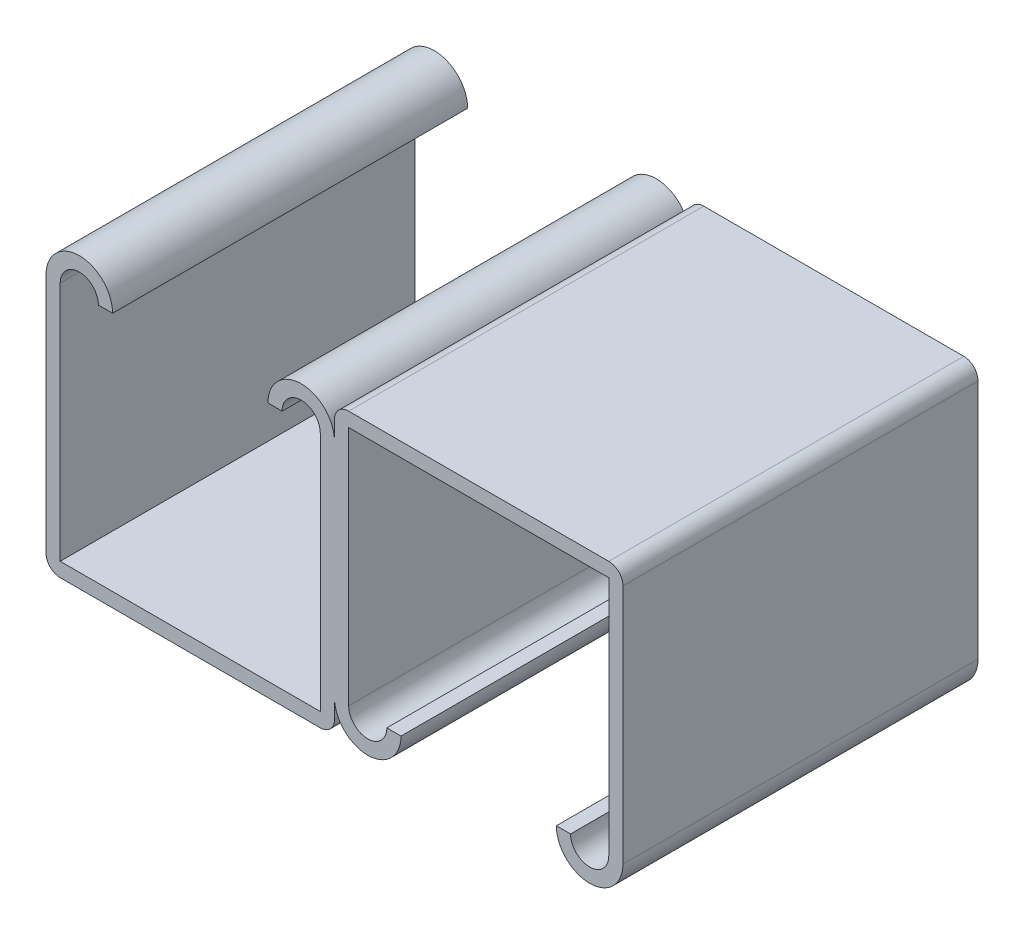
ISO-10303-21;
HEADER;
FILE_DESCRIPTION(('STEP AP214'),'2;1');
FILE_NAME('part.step','',(''),(''),'','','');
FILE_SCHEMA(('AUTOMOTIVE_DESIGN { 1 0 10303 214 1 1 1 1 }'));
ENDSEC;
DATA;
#1=APPLICATION_CONTEXT('core data for automotive mechanical design processes');
#2=APPLICATION_PROTOCOL_DEFINITION('international standard','automotive_design',2000,#1);
#3=PRODUCT_CONTEXT('',#1,'mechanical');
#4=PRODUCT('Part','Part','',(#3));
#5=PRODUCT_RELATED_PRODUCT_CATEGORY('part','',(#4));
#6=PRODUCT_DEFINITION_FORMATION('','',#4);
#7=PRODUCT_DEFINITION_CONTEXT('part definition',#1,'design');
#8=PRODUCT_DEFINITION('design','',#6,#7);
#9=PRODUCT_DEFINITION_SHAPE('','',#8);
#10=(LENGTH_UNIT() NAMED_UNIT(*) SI_UNIT(.MILLI.,.METRE.));
#11=(NAMED_UNIT(*) PLANE_ANGLE_UNIT() SI_UNIT($,.RADIAN.));
#12=(NAMED_UNIT(*) SI_UNIT($,.STERADIAN.) SOLID_ANGLE_UNIT());
#13=UNCERTAINTY_MEASURE_WITH_UNIT(LENGTH_MEASURE(1.E-05),#10,'distance_accuracy_value','');
#14=(GEOMETRIC_REPRESENTATION_CONTEXT(3) GLOBAL_UNCERTAINTY_ASSIGNED_CONTEXT((#13)) GLOBAL_UNIT_ASSIGNED_CONTEXT((#10,
#11,#12)) REPRESENTATION_CONTEXT('',''));
#15=CARTESIAN_POINT('',(0.,0.,0.));
#16=DIRECTION('',(0.,0.,1.));
#17=DIRECTION('',(1.,0.,0.));
#18=AXIS2_PLACEMENT_3D('',#15,#16,#17);
#19=CARTESIAN_POINT('',(-18.25625,7.9375,12.7));
#20=DIRECTION('',(0.,0.,-1.));
#21=DIRECTION('',(-1.,0.,0.));
#22=AXIS2_PLACEMENT_3D('',#19,#20,#21);
#23=CYLINDRICAL_SURFACE('',#22,2.38125);
#24=CARTESIAN_POINT('',(-18.25625,7.9375,-12.7));
#25=DIRECTION('',(0.,0.,1.));
#26=DIRECTION('',(-1.,0.,0.));
#27=AXIS2_PLACEMENT_3D('',#24,#25,#26);
#28=CIRCLE('',#27,2.38125);
#29=CARTESIAN_POINT('',(-15.875,7.9375,-12.7));
#30=VERTEX_POINT('',#29);
#31=CARTESIAN_POINT('',(-20.6375,7.9375,-12.7));
#32=VERTEX_POINT('',#31);
#33=EDGE_CURVE('E242',#30,#32,#28,.T.);
#34=ORIENTED_EDGE('',*,*,#33,.T.);
#35=DIRECTION('',(0.,0.,-1.));
#36=VECTOR('',#35,1.);
#37=CARTESIAN_POINT('',(-20.6375,7.9375,12.7));
#38=LINE('',#37,#36);
#39=CARTESIAN_POINT('',(-20.6375,7.9375,12.7));
#40=VERTEX_POINT('',#39);
#41=EDGE_CURVE('E11',#40,#32,#38,.T.);
#42=ORIENTED_EDGE('',*,*,#41,.F.);
#43=CARTESIAN_POINT('',(-18.25625,7.9375,12.7));
#44=DIRECTION('',(0.,0.,1.));
#45=DIRECTION('',(-1.,0.,0.));
#46=AXIS2_PLACEMENT_3D('',#43,#44,#45);
#47=CIRCLE('',#46,2.38125);
#48=CARTESIAN_POINT('',(-15.875,7.9375,12.7));
#49=VERTEX_POINT('',#48);
#50=EDGE_CURVE('E251',#49,#40,#47,.T.);
#51=ORIENTED_EDGE('',*,*,#50,.F.);
#52=DIRECTION('',(0.,0.,-1.));
#53=VECTOR('',#52,1.);
#54=CARTESIAN_POINT('',(-15.875,7.9375,12.7));
#55=LINE('',#54,#53);
#56=EDGE_CURVE('E279',#49,#30,#55,.T.);
#57=ORIENTED_EDGE('',*,*,#56,.T.);
#58=EDGE_LOOP('',(#34,#42,#51,#57));
#59=FACE_BOUND('',#58,.T.);
#60=ADVANCED_FACE('F32',(#59),#23,.T.);
#61=CARTESIAN_POINT('',(-20.6375,7.9375,12.7));
#62=DIRECTION('',(1.,0.,0.));
#63=DIRECTION('',(0.,1.,0.));
#64=AXIS2_PLACEMENT_3D('',#61,#62,#63);
#65=PLANE('',#64);
#66=DIRECTION('',(0.,-1.,0.));
#67=VECTOR('',#66,1.);
#68=CARTESIAN_POINT('',(-20.6375,7.9375,-12.7));
#69=LINE('',#68,#67);
#70=CARTESIAN_POINT('',(-20.6375,-9.30275,-12.7));
#71=VERTEX_POINT('',#70);
#72=EDGE_CURVE('E245',#32,#71,#69,.T.);
#73=ORIENTED_EDGE('',*,*,#72,.T.);
#74=DIRECTION('',(0.,0.,-1.));
#75=VECTOR('',#74,1.);
#76=CARTESIAN_POINT('',(-20.6375,-9.30275,12.7));
#77=LINE('',#76,#75);
#78=CARTESIAN_POINT('',(-20.6375,-9.30275,12.7));
#79=VERTEX_POINT('',#78);
#80=EDGE_CURVE('E39',#79,#71,#77,.T.);
#81=ORIENTED_EDGE('',*,*,#80,.F.);
#82=DIRECTION('',(0.,-1.,0.));
#83=VECTOR('',#82,1.);
#84=CARTESIAN_POINT('',(-20.6375,7.9375,12.7));
#85=LINE('',#84,#83);
#86=EDGE_CURVE('E253',#40,#79,#85,.T.);
#87=ORIENTED_EDGE('',*,*,#86,.F.);
#88=ORIENTED_EDGE('',*,*,#41,.T.);
#89=EDGE_LOOP('',(#73,#81,#87,#88));
#90=FACE_BOUND('',#89,.T.);
#91=ADVANCED_FACE('F361',(#90),#65,.F.);
#92=CARTESIAN_POINT('',(-19.6215,-9.30275,12.7));
#93=DIRECTION('',(0.,0.,-1.));
#94=DIRECTION('',(-1.,0.,0.));
#95=AXIS2_PLACEMENT_3D('',#92,#93,#94);
#96=CYLINDRICAL_SURFACE('',#95,1.016);
#97=CARTESIAN_POINT('',(-19.6215,-9.30275,-12.7));
#98=DIRECTION('',(0.,0.,1.));
#99=DIRECTION('',(-1.,0.,0.));
#100=AXIS2_PLACEMENT_3D('',#97,#98,#99);
#101=CIRCLE('',#100,1.016);
#102=CARTESIAN_POINT('',(-19.6215,-10.31875,-12.7));
#103=VERTEX_POINT('',#102);
#104=EDGE_CURVE('E282',#71,#103,#101,.T.);
#105=ORIENTED_EDGE('',*,*,#104,.T.);
#106=DIRECTION('',(0.,0.,-1.));
#107=VECTOR('',#106,1.);
#108=CARTESIAN_POINT('',(-19.6215,-10.31875,12.7));
#109=LINE('',#108,#107);
#110=CARTESIAN_POINT('',(-19.6215,-10.31875,12.7));
#111=VERTEX_POINT('',#110);
#112=EDGE_CURVE('E335',#111,#103,#109,.T.);
#113=ORIENTED_EDGE('',*,*,#112,.F.);
#114=CARTESIAN_POINT('',(-19.6215,-9.30275,12.7));
#115=DIRECTION('',(0.,0.,1.));
#116=DIRECTION('',(-1.,0.,0.));
#117=AXIS2_PLACEMENT_3D('',#114,#115,#116);
#118=CIRCLE('',#117,1.016);
#119=EDGE_CURVE('E256',#79,#111,#118,.T.);
#120=ORIENTED_EDGE('',*,*,#119,.F.);
#121=ORIENTED_EDGE('',*,*,#80,.T.);
#122=EDGE_LOOP('',(#105,#113,#120,#121));
#123=FACE_BOUND('',#122,.T.);
#124=ADVANCED_FACE('F342',(#123),#96,.T.);
#125=CARTESIAN_POINT('',(-19.6215,-10.31875,12.7));
#126=DIRECTION('',(0.,1.,0.));
#127=DIRECTION('',(-1.,0.,0.));
#128=AXIS2_PLACEMENT_3D('',#125,#126,#127);
#129=PLANE('',#128);
#130=DIRECTION('',(1.,0.,0.));
#131=VECTOR('',#130,1.);
#132=CARTESIAN_POINT('',(-19.6215,-10.31875,-12.7));
#133=LINE('',#132,#131);
#134=CARTESIAN_POINT('',(-1.016,-10.31875,-12.7));
#135=VERTEX_POINT('',#134);
#136=EDGE_CURVE('E284',#103,#135,#133,.T.);
#137=ORIENTED_EDGE('',*,*,#136,.T.);
#138=DIRECTION('',(0.,0.,-1.));
#139=VECTOR('',#138,1.);
#140=CARTESIAN_POINT('',(-1.016,-10.31875,12.7));
#141=LINE('',#140,#139);
#142=CARTESIAN_POINT('',(-1.016,-10.31875,12.7));
#143=VERTEX_POINT('',#142);
#144=EDGE_CURVE('E332',#143,#135,#141,.T.);
#145=ORIENTED_EDGE('',*,*,#144,.F.);
#146=DIRECTION('',(1.,0.,0.));
#147=VECTOR('',#146,1.);
#148=CARTESIAN_POINT('',(-19.6215,-10.31875,12.7));
#149=LINE('',#148,#147);
#150=EDGE_CURVE('E258',#111,#143,#149,.T.);
#151=ORIENTED_EDGE('',*,*,#150,.F.);
#152=ORIENTED_EDGE('',*,*,#112,.T.);
#153=EDGE_LOOP('',(#137,#145,#151,#152));
#154=FACE_BOUND('',#153,.T.);
#155=ADVANCED_FACE('F352',(#154),#129,.F.);
#156=CARTESIAN_POINT('',(-1.016,-9.30275,12.7));
#157=DIRECTION('',(0.,0.,-1.));
#158=DIRECTION('',(-1.,0.,0.));
#159=AXIS2_PLACEMENT_3D('',#156,#157,#158);
#160=CYLINDRICAL_SURFACE('',#159,1.016);
#161=CARTESIAN_POINT('',(-1.016,-9.30275,-12.7));
#162=DIRECTION('',(0.,0.,1.));
#163=DIRECTION('',(1.,0.,0.));
#164=AXIS2_PLACEMENT_3D('',#161,#162,#163);
#165=CIRCLE('',#164,1.016);
#166=CARTESIAN_POINT('',(0.,-9.30275,-12.7));
#167=VERTEX_POINT('',#166);
#168=EDGE_CURVE('E286',#135,#167,#165,.T.);
#169=ORIENTED_EDGE('',*,*,#168,.T.);
#170=DIRECTION('',(0.,0.,-1.));
#171=VECTOR('',#170,1.);
#172=CARTESIAN_POINT('',(0.,-9.30275,12.7));
#173=LINE('',#172,#171);
#174=CARTESIAN_POINT('',(0.,-9.30275,12.7));
#175=VERTEX_POINT('',#174);
#176=EDGE_CURVE('E330',#175,#167,#173,.T.);
#177=ORIENTED_EDGE('',*,*,#176,.F.);
#178=CARTESIAN_POINT('',(-1.016,-9.30275,12.7));
#179=DIRECTION('',(0.,0.,1.));
#180=DIRECTION('',(1.,0.,0.));
#181=AXIS2_PLACEMENT_3D('',#178,#179,#180);
#182=CIRCLE('',#181,1.016);
#183=EDGE_CURVE('E260',#143,#175,#182,.T.);
#184=ORIENTED_EDGE('',*,*,#183,.F.);
#185=ORIENTED_EDGE('',*,*,#144,.T.);
#186=EDGE_LOOP('',(#169,#177,#184,#185));
#187=FACE_BOUND('',#186,.T.);
#188=ADVANCED_FACE('F356',(#187),#160,.T.);
#189=CARTESIAN_POINT('',(0.,-9.30275,12.7));
#190=DIRECTION('',(-1.,0.,0.));
#191=DIRECTION('',(0.,0.,1.));
#192=AXIS2_PLACEMENT_3D('',#189,#190,#191);
#193=PLANE('',#192);
#194=DIRECTION('',(0.,1.,0.));
#195=VECTOR('',#194,1.);
#196=CARTESIAN_POINT('',(0.,-9.30275,-12.7));
#197=LINE('',#196,#195);
#198=CARTESIAN_POINT('',(0.,-7.93749999999998,-12.7));
#199=VERTEX_POINT('',#198);
#200=EDGE_CURVE('E51',#167,#199,#197,.T.);
#201=ORIENTED_EDGE('',*,*,#200,.T.);
#202=DIRECTION('',(0.,0.,-1.));
#203=VECTOR('',#202,1.);
#204=CARTESIAN_POINT('',(0.,-7.9375,12.7));
#205=LINE('',#204,#203);
#206=CARTESIAN_POINT('',(0.,-7.93749999999998,12.7));
#207=VERTEX_POINT('',#206);
#208=EDGE_CURVE('E46',#207,#199,#205,.T.);
#209=ORIENTED_EDGE('',*,*,#208,.F.);
#210=DIRECTION('',(0.,1.,0.));
#211=VECTOR('',#210,1.);
#212=CARTESIAN_POINT('',(0.,-9.30275,12.7));
#213=LINE('',#212,#211);
#214=EDGE_CURVE('E262',#175,#207,#213,.T.);
#215=ORIENTED_EDGE('',*,*,#214,.F.);
#216=ORIENTED_EDGE('',*,*,#176,.T.);
#217=EDGE_LOOP('',(#201,#209,#215,#216));
#218=FACE_BOUND('',#217,.T.);
#219=ADVANCED_FACE('F520',(#218),#193,.F.);
#220=CARTESIAN_POINT('',(-2.38125,7.9375,12.7));
#221=DIRECTION('',(0.,0.,-1.));
#222=DIRECTION('',(-1.,0.,0.));
#223=AXIS2_PLACEMENT_3D('',#220,#221,#222);
#224=CYLINDRICAL_SURFACE('',#223,2.38125);
#225=CARTESIAN_POINT('',(-2.38125,7.9375,-12.7));
#226=DIRECTION('',(0.,0.,1.));
#227=DIRECTION('',(1.,0.,0.));
#228=AXIS2_PLACEMENT_3D('',#225,#226,#227);
#229=CIRCLE('',#228,2.38125);
#230=CARTESIAN_POINT('',(0.,7.93750000000002,-12.7));
#231=VERTEX_POINT('',#230);
#232=CARTESIAN_POINT('',(-4.7625,7.9375,-12.7));
#233=VERTEX_POINT('',#232);
#234=EDGE_CURVE('E289',#231,#233,#229,.T.);
#235=ORIENTED_EDGE('',*,*,#234,.T.);
#236=DIRECTION('',(0.,0.,-1.));
#237=VECTOR('',#236,1.);
#238=CARTESIAN_POINT('',(-4.7625,7.9375,12.7));
#239=LINE('',#238,#237);
#240=CARTESIAN_POINT('',(-4.7625,7.9375,12.7));
#241=VERTEX_POINT('',#240);
#242=EDGE_CURVE('E324',#241,#233,#239,.T.);
#243=ORIENTED_EDGE('',*,*,#242,.F.);
#244=CARTESIAN_POINT('',(-2.38125,7.9375,12.7));
#245=DIRECTION('',(0.,0.,1.));
#246=DIRECTION('',(1.,0.,0.));
#247=AXIS2_PLACEMENT_3D('',#244,#245,#246);
#248=CIRCLE('',#247,2.38125);
#249=CARTESIAN_POINT('',(0.,7.9375,12.7));
#250=VERTEX_POINT('',#249);
#251=EDGE_CURVE('E264',#250,#241,#248,.T.);
#252=ORIENTED_EDGE('',*,*,#251,.F.);
#253=DIRECTION('',(0.,0.,-1.));
#254=VECTOR('',#253,1.);
#255=CARTESIAN_POINT('',(0.,7.9375,12.7));
#256=LINE('',#255,#254);
#257=EDGE_CURVE('E327',#250,#231,#256,.T.);
#258=ORIENTED_EDGE('',*,*,#257,.T.);
#259=EDGE_LOOP('',(#235,#243,#252,#258));
#260=FACE_BOUND('',#259,.T.);
#261=ADVANCED_FACE('F401',(#260),#224,.T.);
#262=CARTESIAN_POINT('',(-4.7625,7.9375,12.7));
#263=DIRECTION('',(0.,1.,0.));
#264=DIRECTION('',(0.,0.,1.));
#265=AXIS2_PLACEMENT_3D('',#262,#263,#264);
#266=PLANE('',#265);
#267=DIRECTION('',(1.,0.,0.));
#268=VECTOR('',#267,1.);
#269=CARTESIAN_POINT('',(-4.7625,7.9375,-12.7));
#270=LINE('',#269,#268);
#271=CARTESIAN_POINT('',(-3.7465,7.9375,-12.7));
#272=VERTEX_POINT('',#271);
#273=EDGE_CURVE('E291',#233,#272,#270,.T.);
#274=ORIENTED_EDGE('',*,*,#273,.T.);
#275=DIRECTION('',(0.,0.,-1.));
#276=VECTOR('',#275,1.);
#277=CARTESIAN_POINT('',(-3.7465,7.9375,12.7));
#278=LINE('',#277,#276);
#279=CARTESIAN_POINT('',(-3.7465,7.9375,12.7));
#280=VERTEX_POINT('',#279);
#281=EDGE_CURVE('E321',#280,#272,#278,.T.);
#282=ORIENTED_EDGE('',*,*,#281,.F.);
#283=DIRECTION('',(1.,0.,0.));
#284=VECTOR('',#283,1.);
#285=CARTESIAN_POINT('',(-4.7625,7.9375,12.7));
#286=LINE('',#285,#284);
#287=EDGE_CURVE('E266',#241,#280,#286,.T.);
#288=ORIENTED_EDGE('',*,*,#287,.F.);
#289=ORIENTED_EDGE('',*,*,#242,.T.);
#290=EDGE_LOOP('',(#274,#282,#288,#289));
#291=FACE_BOUND('',#290,.T.);
#292=ADVANCED_FACE('F397',(#291),#266,.F.);
#293=CARTESIAN_POINT('',(-2.38125,7.9375,12.7));
#294=DIRECTION('',(0.,0.,-1.));
#295=DIRECTION('',(-1.,0.,0.));
#296=AXIS2_PLACEMENT_3D('',#293,#294,#295);
#297=CYLINDRICAL_SURFACE('',#296,1.36525);
#298=CARTESIAN_POINT('',(-2.38125,7.9375,-12.7));
#299=DIRECTION('',(0.,0.,-1.));
#300=DIRECTION('',(1.,0.,0.));
#301=AXIS2_PLACEMENT_3D('',#298,#299,#300);
#302=CIRCLE('',#301,1.36525);
#303=CARTESIAN_POINT('',(-1.016,7.9375,-12.7));
#304=VERTEX_POINT('',#303);
#305=EDGE_CURVE('E293',#272,#304,#302,.T.);
#306=ORIENTED_EDGE('',*,*,#305,.T.);
#307=DIRECTION('',(0.,0.,-1.));
#308=VECTOR('',#307,1.);
#309=CARTESIAN_POINT('',(-1.016,7.9375,12.7));
#310=LINE('',#309,#308);
#311=CARTESIAN_POINT('',(-1.016,7.9375,12.7));
#312=VERTEX_POINT('',#311);
#313=EDGE_CURVE('E318',#312,#304,#310,.T.);
#314=ORIENTED_EDGE('',*,*,#313,.F.);
#315=CARTESIAN_POINT('',(-2.38125,7.9375,12.7));
#316=DIRECTION('',(0.,0.,-1.));
#317=DIRECTION('',(1.,0.,0.));
#318=AXIS2_PLACEMENT_3D('',#315,#316,#317);
#319=CIRCLE('',#318,1.36525);
#320=EDGE_CURVE('E268',#280,#312,#319,.T.);
#321=ORIENTED_EDGE('',*,*,#320,.F.);
#322=ORIENTED_EDGE('',*,*,#281,.T.);
#323=EDGE_LOOP('',(#306,#314,#321,#322));
#324=FACE_BOUND('',#323,.T.);
#325=ADVANCED_FACE('F392',(#324),#297,.F.);
#326=CARTESIAN_POINT('',(-1.016,-9.30275,12.7));
#327=DIRECTION('',(1.,0.,0.));
#328=DIRECTION('',(0.,0.,-1.));
#329=AXIS2_PLACEMENT_3D('',#326,#327,#328);
#330=PLANE('',#329);
#331=DIRECTION('',(0.,-1.,0.));
#332=VECTOR('',#331,1.);
#333=CARTESIAN_POINT('',(-1.016,-9.30275,-12.7));
#334=LINE('',#333,#332);
#335=CARTESIAN_POINT('',(-1.016,-9.30275,-12.7));
#336=VERTEX_POINT('',#335);
#337=EDGE_CURVE('E295',#304,#336,#334,.T.);
#338=ORIENTED_EDGE('',*,*,#337,.T.);
#339=DIRECTION('',(0.,0.,-1.));
#340=VECTOR('',#339,1.);
#341=CARTESIAN_POINT('',(-1.016,-9.30275,12.7));
#342=LINE('',#341,#340);
#343=CARTESIAN_POINT('',(-1.016,-9.30275,12.7));
#344=VERTEX_POINT('',#343);
#345=EDGE_CURVE('E315',#344,#336,#342,.T.);
#346=ORIENTED_EDGE('',*,*,#345,.F.);
#347=DIRECTION('',(0.,-1.,0.));
#348=VECTOR('',#347,1.);
#349=CARTESIAN_POINT('',(-1.016,-9.30275,12.7));
#350=LINE('',#349,#348);
#351=EDGE_CURVE('E270',#312,#344,#350,.T.);
#352=ORIENTED_EDGE('',*,*,#351,.F.);
#353=ORIENTED_EDGE('',*,*,#313,.T.);
#354=EDGE_LOOP('',(#338,#346,#352,#353));
#355=FACE_BOUND('',#354,.T.);
#356=ADVANCED_FACE('F388',(#355),#330,.F.);
#357=CARTESIAN_POINT('',(-19.6215,-9.30275,12.7));
#358=DIRECTION('',(0.,-1.,0.));
#359=DIRECTION('',(0.,0.,-1.));
#360=AXIS2_PLACEMENT_3D('',#357,#358,#359);
#361=PLANE('',#360);
#362=DIRECTION('',(-1.,0.,0.));
#363=VECTOR('',#362,1.);
#364=CARTESIAN_POINT('',(-19.6215,-9.30275,-12.7));
#365=LINE('',#364,#363);
#366=CARTESIAN_POINT('',(-19.6215,-9.30275,-12.7));
#367=VERTEX_POINT('',#366);
#368=EDGE_CURVE('E297',#336,#367,#365,.T.);
#369=ORIENTED_EDGE('',*,*,#368,.T.);
#370=DIRECTION('',(0.,0.,-1.));
#371=VECTOR('',#370,1.);
#372=CARTESIAN_POINT('',(-19.6215,-9.30275,12.7));
#373=LINE('',#372,#371);
#374=CARTESIAN_POINT('',(-19.6215,-9.30275,12.7));
#375=VERTEX_POINT('',#374);
#376=EDGE_CURVE('E312',#375,#367,#373,.T.);
#377=ORIENTED_EDGE('',*,*,#376,.F.);
#378=DIRECTION('',(-1.,0.,0.));
#379=VECTOR('',#378,1.);
#380=CARTESIAN_POINT('',(-19.6215,-9.30275,12.7));
#381=LINE('',#380,#379);
#382=EDGE_CURVE('E272',#344,#375,#381,.T.);
#383=ORIENTED_EDGE('',*,*,#382,.F.);
#384=ORIENTED_EDGE('',*,*,#345,.T.);
#385=EDGE_LOOP('',(#369,#377,#383,#384));
#386=FACE_BOUND('',#385,.T.);
#387=ADVANCED_FACE('F383',(#386),#361,.F.);
#388=CARTESIAN_POINT('',(-19.6215,7.9375,12.7));
#389=DIRECTION('',(-1.,0.,0.));
#390=DIRECTION('',(0.,0.,1.));
#391=AXIS2_PLACEMENT_3D('',#388,#389,#390);
#392=PLANE('',#391);
#393=DIRECTION('',(0.,1.,0.));
#394=VECTOR('',#393,1.);
#395=CARTESIAN_POINT('',(-19.6215,7.9375,-12.7));
#396=LINE('',#395,#394);
#397=CARTESIAN_POINT('',(-19.6215,7.9375,-12.7));
#398=VERTEX_POINT('',#397);
#399=EDGE_CURVE('E299',#367,#398,#396,.T.);
#400=ORIENTED_EDGE('',*,*,#399,.T.);
#401=DIRECTION('',(0.,0.,-1.));
#402=VECTOR('',#401,1.);
#403=CARTESIAN_POINT('',(-19.6215,7.9375,12.7));
#404=LINE('',#403,#402);
#405=CARTESIAN_POINT('',(-19.6215,7.9375,12.7));
#406=VERTEX_POINT('',#405);
#407=EDGE_CURVE('E309',#406,#398,#404,.T.);
#408=ORIENTED_EDGE('',*,*,#407,.F.);
#409=DIRECTION('',(0.,1.,0.));
#410=VECTOR('',#409,1.);
#411=CARTESIAN_POINT('',(-19.6215,7.9375,12.7));
#412=LINE('',#411,#410);
#413=EDGE_CURVE('E274',#375,#406,#412,.T.);
#414=ORIENTED_EDGE('',*,*,#413,.F.);
#415=ORIENTED_EDGE('',*,*,#376,.T.);
#416=EDGE_LOOP('',(#400,#408,#414,#415));
#417=FACE_BOUND('',#416,.T.);
#418=ADVANCED_FACE('F377',(#417),#392,.F.);
#419=CARTESIAN_POINT('',(-18.25625,7.9375,12.7));
#420=DIRECTION('',(0.,0.,-1.));
#421=DIRECTION('',(-1.,0.,0.));
#422=AXIS2_PLACEMENT_3D('',#419,#420,#421);
#423=CYLINDRICAL_SURFACE('',#422,1.36525);
#424=CARTESIAN_POINT('',(-18.25625,7.9375,-12.7));
#425=DIRECTION('',(0.,0.,-1.));
#426=DIRECTION('',(-1.,0.,0.));
#427=AXIS2_PLACEMENT_3D('',#424,#425,#426);
#428=CIRCLE('',#427,1.36525);
#429=CARTESIAN_POINT('',(-16.891,7.9375,-12.7));
#430=VERTEX_POINT('',#429);
#431=EDGE_CURVE('E301',#398,#430,#428,.T.);
#432=ORIENTED_EDGE('',*,*,#431,.T.);
#433=DIRECTION('',(0.,0.,-1.));
#434=VECTOR('',#433,1.);
#435=CARTESIAN_POINT('',(-16.891,7.9375,12.7));
#436=LINE('',#435,#434);
#437=CARTESIAN_POINT('',(-16.891,7.9375,12.7));
#438=VERTEX_POINT('',#437);
#439=EDGE_CURVE('E306',#438,#430,#436,.T.);
#440=ORIENTED_EDGE('',*,*,#439,.F.);
#441=CARTESIAN_POINT('',(-18.25625,7.9375,12.7));
#442=DIRECTION('',(0.,0.,-1.));
#443=DIRECTION('',(-1.,0.,0.));
#444=AXIS2_PLACEMENT_3D('',#441,#442,#443);
#445=CIRCLE('',#444,1.36525);
#446=EDGE_CURVE('E276',#406,#438,#445,.T.);
#447=ORIENTED_EDGE('',*,*,#446,.F.);
#448=ORIENTED_EDGE('',*,*,#407,.T.);
#449=EDGE_LOOP('',(#432,#440,#447,#448));
#450=FACE_BOUND('',#449,.T.);
#451=ADVANCED_FACE('F373',(#450),#423,.F.);
#452=CARTESIAN_POINT('',(-16.891,7.9375,12.7));
#453=DIRECTION('',(0.,1.,0.));
#454=DIRECTION('',(0.,0.,1.));
#455=AXIS2_PLACEMENT_3D('',#452,#453,#454);
#456=PLANE('',#455);
#457=DIRECTION('',(1.,0.,0.));
#458=VECTOR('',#457,1.);
#459=CARTESIAN_POINT('',(-16.891,7.9375,-12.7));
#460=LINE('',#459,#458);
#461=EDGE_CURVE('E254',#430,#30,#460,.T.);
#462=ORIENTED_EDGE('',*,*,#461,.T.);
#463=ORIENTED_EDGE('',*,*,#56,.F.);
#464=DIRECTION('',(1.,0.,0.));
#465=VECTOR('',#464,1.);
#466=CARTESIAN_POINT('',(-16.891,7.9375,12.7));
#467=LINE('',#466,#465);
#468=EDGE_CURVE('E278',#438,#49,#467,.T.);
#469=ORIENTED_EDGE('',*,*,#468,.F.);
#470=ORIENTED_EDGE('',*,*,#439,.T.);
#471=EDGE_LOOP('',(#462,#463,#469,#470));
#472=FACE_BOUND('',#471,.T.);
#473=ADVANCED_FACE('F368',(#472),#456,.F.);
#474=CARTESIAN_POINT('',(-18.25625,7.9375,12.7));
#475=DIRECTION('',(0.,0.,-1.));
#476=DIRECTION('',(-1.,0.,0.));
#477=AXIS2_PLACEMENT_3D('',#474,#475,#476);
#478=PLANE('',#477);
#479=ORIENTED_EDGE('',*,*,#50,.T.);
#480=ORIENTED_EDGE('',*,*,#86,.T.);
#481=ORIENTED_EDGE('',*,*,#119,.T.);
#482=ORIENTED_EDGE('',*,*,#150,.T.);
#483=ORIENTED_EDGE('',*,*,#183,.T.);
#484=ORIENTED_EDGE('',*,*,#214,.T.);
#485=CARTESIAN_POINT('',(2.38125000000006,-7.93749999999998,12.7));
#486=DIRECTION('',(0.,0.,1.));
#487=DIRECTION('',(-1.,0.,0.));
#488=AXIS2_PLACEMENT_3D('',#485,#486,#487);
#489=CIRCLE('',#488,2.38125);
#490=CARTESIAN_POINT('',(4.76250000000006,-7.93749999999997,12.7));
#491=VERTEX_POINT('',#490);
#492=EDGE_CURVE('E490',#207,#491,#489,.T.);
#493=ORIENTED_EDGE('',*,*,#492,.T.);
#494=DIRECTION('',(-1.,0.,0.));
#495=VECTOR('',#494,1.);
#496=CARTESIAN_POINT('',(4.76250000000006,-7.93749999999997,12.7));
#497=LINE('',#496,#495);
#498=CARTESIAN_POINT('',(3.74650000000006,-7.93749999999997,12.7));
#499=VERTEX_POINT('',#498);
#500=EDGE_CURVE('E488',#491,#499,#497,.T.);
#501=ORIENTED_EDGE('',*,*,#500,.T.);
#502=CARTESIAN_POINT('',(2.38125000000006,-7.93749999999998,12.7));
#503=DIRECTION('',(0.,0.,-1.));
#504=DIRECTION('',(-1.,0.,0.));
#505=AXIS2_PLACEMENT_3D('',#502,#503,#504);
#506=CIRCLE('',#505,1.36525);
#507=CARTESIAN_POINT('',(1.01600000000006,-7.93749999999999,12.7));
#508=VERTEX_POINT('',#507);
#509=EDGE_CURVE('E486',#499,#508,#506,.T.);
#510=ORIENTED_EDGE('',*,*,#509,.T.);
#511=DIRECTION('',(0.,1.,0.));
#512=VECTOR('',#511,1.);
#513=CARTESIAN_POINT('',(1.01599999999993,9.30275000000001,12.7));
#514=LINE('',#513,#512);
#515=CARTESIAN_POINT('',(1.01599999999993,9.30275000000001,12.7));
#516=VERTEX_POINT('',#515);
#517=EDGE_CURVE('E484',#508,#516,#514,.T.);
#518=ORIENTED_EDGE('',*,*,#517,.T.);
#519=DIRECTION('',(1.,0.,0.));
#520=VECTOR('',#519,1.);
#521=CARTESIAN_POINT('',(19.6214999999999,9.30275000000014,12.7));
#522=LINE('',#521,#520);
#523=CARTESIAN_POINT('',(19.6214999999999,9.30275000000014,12.7));
#524=VERTEX_POINT('',#523);
#525=EDGE_CURVE('E482',#516,#524,#522,.T.);
#526=ORIENTED_EDGE('',*,*,#525,.T.);
#527=DIRECTION('',(0.,-1.,0.));
#528=VECTOR('',#527,1.);
#529=CARTESIAN_POINT('',(19.6215000000001,-7.93749999999986,12.7));
#530=LINE('',#529,#528);
#531=CARTESIAN_POINT('',(19.6215000000001,-7.93749999999986,12.7));
#532=VERTEX_POINT('',#531);
#533=EDGE_CURVE('E480',#524,#532,#530,.T.);
#534=ORIENTED_EDGE('',*,*,#533,.T.);
#535=CARTESIAN_POINT('',(18.2562500000001,-7.93749999999987,12.7));
#536=DIRECTION('',(0.,0.,-1.));
#537=DIRECTION('',(1.,0.,0.));
#538=AXIS2_PLACEMENT_3D('',#535,#536,#537);
#539=CIRCLE('',#538,1.36525);
#540=CARTESIAN_POINT('',(16.8910000000001,-7.93749999999988,12.7));
#541=VERTEX_POINT('',#540);
#542=EDGE_CURVE('E478',#532,#541,#539,.T.);
#543=ORIENTED_EDGE('',*,*,#542,.T.);
#544=DIRECTION('',(-1.,0.,0.));
#545=VECTOR('',#544,1.);
#546=CARTESIAN_POINT('',(16.8910000000001,-7.93749999999988,12.7));
#547=LINE('',#546,#545);
#548=CARTESIAN_POINT('',(15.8750000000001,-7.93749999999989,12.7));
#549=VERTEX_POINT('',#548);
#550=EDGE_CURVE('E233',#541,#549,#547,.T.);
#551=ORIENTED_EDGE('',*,*,#550,.T.);
#552=CARTESIAN_POINT('',(18.2562500000001,-7.93749999999987,12.7));
#553=DIRECTION('',(0.,0.,1.));
#554=DIRECTION('',(1.,0.,0.));
#555=AXIS2_PLACEMENT_3D('',#552,#553,#554);
#556=CIRCLE('',#555,2.38125);
#557=CARTESIAN_POINT('',(20.6375000000001,-7.93749999999986,12.7));
#558=VERTEX_POINT('',#557);
#559=EDGE_CURVE('E227',#549,#558,#556,.T.);
#560=ORIENTED_EDGE('',*,*,#559,.T.);
#561=DIRECTION('',(0.,1.,0.));
#562=VECTOR('',#561,1.);
#563=CARTESIAN_POINT('',(20.6375000000001,-7.93749999999986,12.7));
#564=LINE('',#563,#562);
#565=CARTESIAN_POINT('',(20.6374999999999,9.30275000000014,12.7));
#566=VERTEX_POINT('',#565);
#567=EDGE_CURVE('E216',#558,#566,#564,.T.);
#568=ORIENTED_EDGE('',*,*,#567,.T.);
#569=CARTESIAN_POINT('',(19.6214999999999,9.30275000000014,12.7));
#570=DIRECTION('',(0.,0.,1.));
#571=DIRECTION('',(1.,0.,0.));
#572=AXIS2_PLACEMENT_3D('',#569,#570,#571);
#573=CIRCLE('',#572,1.016);
#574=CARTESIAN_POINT('',(19.6214999999999,10.3187500000001,12.7));
#575=VERTEX_POINT('',#574);
#576=EDGE_CURVE('E226',#566,#575,#573,.T.);
#577=ORIENTED_EDGE('',*,*,#576,.T.);
#578=DIRECTION('',(-1.,0.,0.));
#579=VECTOR('',#578,1.);
#580=CARTESIAN_POINT('',(19.6214999999999,10.3187500000001,12.7));
#581=LINE('',#580,#579);
#582=CARTESIAN_POINT('',(1.01599999999993,10.31875,12.7));
#583=VERTEX_POINT('',#582);
#584=EDGE_CURVE('E468',#575,#583,#581,.T.);
#585=ORIENTED_EDGE('',*,*,#584,.T.);
#586=CARTESIAN_POINT('',(1.01599999999993,9.30275000000001,12.7));
#587=DIRECTION('',(0.,0.,1.));
#588=DIRECTION('',(-1.,0.,0.));
#589=AXIS2_PLACEMENT_3D('',#586,#587,#588);
#590=CIRCLE('',#589,1.016);
#591=CARTESIAN_POINT('',(0.,9.30275,12.7));
#592=VERTEX_POINT('',#591);
#593=EDGE_CURVE('E494',#583,#592,#590,.T.);
#594=ORIENTED_EDGE('',*,*,#593,.T.);
#595=DIRECTION('',(0.,-1.,0.));
#596=VECTOR('',#595,1.);
#597=CARTESIAN_POINT('',(0.,9.30275,12.7));
#598=LINE('',#597,#596);
#599=EDGE_CURVE('E492',#592,#250,#598,.T.);
#600=ORIENTED_EDGE('',*,*,#599,.T.);
#601=ORIENTED_EDGE('',*,*,#251,.T.);
#602=ORIENTED_EDGE('',*,*,#287,.T.);
#603=ORIENTED_EDGE('',*,*,#320,.T.);
#604=ORIENTED_EDGE('',*,*,#351,.T.);
#605=ORIENTED_EDGE('',*,*,#382,.T.);
#606=ORIENTED_EDGE('',*,*,#413,.T.);
#607=ORIENTED_EDGE('',*,*,#446,.T.);
#608=ORIENTED_EDGE('',*,*,#468,.T.);
#609=EDGE_LOOP('',(#479,#480,#481,#482,#483,#484,#493,#501,#510,#518,#526,#534,#543,#551,#560,
#568,#577,#585,#594,#600,#601,#602,#603,#604,#605,#606,#607,#608));
#610=FACE_BOUND('',#609,.T.);
#611=ADVANCED_FACE('F231',(#610),#478,.F.);
#612=CARTESIAN_POINT('',(-18.25625,7.9375,-12.7));
#613=DIRECTION('',(0.,0.,-1.));
#614=DIRECTION('',(-1.,0.,0.));
#615=AXIS2_PLACEMENT_3D('',#612,#613,#614);
#616=PLANE('',#615);
#617=ORIENTED_EDGE('',*,*,#33,.F.);
#618=ORIENTED_EDGE('',*,*,#461,.F.);
#619=ORIENTED_EDGE('',*,*,#431,.F.);
#620=ORIENTED_EDGE('',*,*,#399,.F.);
#621=ORIENTED_EDGE('',*,*,#368,.F.);
#622=ORIENTED_EDGE('',*,*,#337,.F.);
#623=ORIENTED_EDGE('',*,*,#305,.F.);
#624=ORIENTED_EDGE('',*,*,#273,.F.);
#625=ORIENTED_EDGE('',*,*,#234,.F.);
#626=DIRECTION('',(0.,-1.,0.));
#627=VECTOR('',#626,1.);
#628=CARTESIAN_POINT('',(0.,9.30275,-12.7));
#629=LINE('',#628,#627);
#630=CARTESIAN_POINT('',(0.,9.30275,-12.7));
#631=VERTEX_POINT('',#630);
#632=EDGE_CURVE('E408',#631,#231,#629,.T.);
#633=ORIENTED_EDGE('',*,*,#632,.F.);
#634=CARTESIAN_POINT('',(1.01599999999993,9.30275000000001,-12.7));
#635=DIRECTION('',(0.,0.,1.));
#636=DIRECTION('',(-1.,0.,0.));
#637=AXIS2_PLACEMENT_3D('',#634,#635,#636);
#638=CIRCLE('',#637,1.016);
#639=CARTESIAN_POINT('',(1.01599999999993,10.31875,-12.7));
#640=VERTEX_POINT('',#639);
#641=EDGE_CURVE('E414',#640,#631,#638,.T.);
#642=ORIENTED_EDGE('',*,*,#641,.F.);
#643=DIRECTION('',(-1.,0.,0.));
#644=VECTOR('',#643,1.);
#645=CARTESIAN_POINT('',(19.6214999999999,10.3187500000001,-12.7));
#646=LINE('',#645,#644);
#647=CARTESIAN_POINT('',(19.6214999999999,10.3187500000001,-12.7));
#648=VERTEX_POINT('',#647);
#649=EDGE_CURVE('E418',#648,#640,#646,.T.);
#650=ORIENTED_EDGE('',*,*,#649,.F.);
#651=CARTESIAN_POINT('',(19.6214999999999,9.30275000000014,-12.7));
#652=DIRECTION('',(0.,0.,1.));
#653=DIRECTION('',(1.,0.,0.));
#654=AXIS2_PLACEMENT_3D('',#651,#652,#653);
#655=CIRCLE('',#654,1.016);
#656=CARTESIAN_POINT('',(20.6374999999999,9.30275000000014,-12.7));
#657=VERTEX_POINT('',#656);
#658=EDGE_CURVE('E471',#657,#648,#655,.T.);
#659=ORIENTED_EDGE('',*,*,#658,.F.);
#660=DIRECTION('',(0.,1.,0.));
#661=VECTOR('',#660,1.);
#662=CARTESIAN_POINT('',(20.6375000000001,-7.93749999999986,-12.7));
#663=LINE('',#662,#661);
#664=CARTESIAN_POINT('',(20.6375000000001,-7.93749999999986,-12.7));
#665=VERTEX_POINT('',#664);
#666=EDGE_CURVE('E472',#665,#657,#663,.T.);
#667=ORIENTED_EDGE('',*,*,#666,.F.);
#668=CARTESIAN_POINT('',(18.2562500000001,-7.93749999999987,-12.7));
#669=DIRECTION('',(0.,0.,1.));
#670=DIRECTION('',(1.,0.,0.));
#671=AXIS2_PLACEMENT_3D('',#668,#669,#670);
#672=CIRCLE('',#671,2.38125);
#673=CARTESIAN_POINT('',(15.8750000000001,-7.93749999999989,-12.7));
#674=VERTEX_POINT('',#673);
#675=EDGE_CURVE('E241',#674,#665,#672,.T.);
#676=ORIENTED_EDGE('',*,*,#675,.F.);
#677=DIRECTION('',(-1.,0.,0.));
#678=VECTOR('',#677,1.);
#679=CARTESIAN_POINT('',(16.8910000000001,-7.93749999999988,-12.7));
#680=LINE('',#679,#678);
#681=CARTESIAN_POINT('',(16.8910000000001,-7.93749999999988,-12.7));
#682=VERTEX_POINT('',#681);
#683=EDGE_CURVE('E237',#682,#674,#680,.T.);
#684=ORIENTED_EDGE('',*,*,#683,.F.);
#685=CARTESIAN_POINT('',(18.2562500000001,-7.93749999999987,-12.7));
#686=DIRECTION('',(0.,0.,-1.));
#687=DIRECTION('',(1.,0.,0.));
#688=AXIS2_PLACEMENT_3D('',#685,#686,#687);
#689=CIRCLE('',#688,1.36525);
#690=CARTESIAN_POINT('',(19.6215000000001,-7.93749999999986,-12.7));
#691=VERTEX_POINT('',#690);
#692=EDGE_CURVE('E431',#691,#682,#689,.T.);
#693=ORIENTED_EDGE('',*,*,#692,.F.);
#694=DIRECTION('',(0.,-1.,0.));
#695=VECTOR('',#694,1.);
#696=CARTESIAN_POINT('',(19.6215000000001,-7.93749999999986,-12.7));
#697=LINE('',#696,#695);
#698=CARTESIAN_POINT('',(19.6214999999999,9.30275000000014,-12.7));
#699=VERTEX_POINT('',#698);
#700=EDGE_CURVE('E429',#699,#691,#697,.T.);
#701=ORIENTED_EDGE('',*,*,#700,.F.);
#702=DIRECTION('',(1.,0.,0.));
#703=VECTOR('',#702,1.);
#704=CARTESIAN_POINT('',(19.6214999999999,9.30275000000014,-12.7));
#705=LINE('',#704,#703);
#706=CARTESIAN_POINT('',(1.01599999999993,9.30275000000001,-12.7));
#707=VERTEX_POINT('',#706);
#708=EDGE_CURVE('E427',#707,#699,#705,.T.);
#709=ORIENTED_EDGE('',*,*,#708,.F.);
#710=DIRECTION('',(0.,1.,0.));
#711=VECTOR('',#710,1.);
#712=CARTESIAN_POINT('',(1.01599999999993,9.30275000000001,-12.7));
#713=LINE('',#712,#711);
#714=CARTESIAN_POINT('',(1.01600000000006,-7.93749999999999,-12.7));
#715=VERTEX_POINT('',#714);
#716=EDGE_CURVE('E425',#715,#707,#713,.T.);
#717=ORIENTED_EDGE('',*,*,#716,.F.);
#718=CARTESIAN_POINT('',(2.38125000000006,-7.93749999999998,-12.7));
#719=DIRECTION('',(0.,0.,-1.));
#720=DIRECTION('',(-1.,0.,0.));
#721=AXIS2_PLACEMENT_3D('',#718,#719,#720);
#722=CIRCLE('',#721,1.36525);
#723=CARTESIAN_POINT('',(3.74650000000006,-7.93749999999997,-12.7));
#724=VERTEX_POINT('',#723);
#725=EDGE_CURVE('E423',#724,#715,#722,.T.);
#726=ORIENTED_EDGE('',*,*,#725,.F.);
#727=DIRECTION('',(-1.,0.,0.));
#728=VECTOR('',#727,1.);
#729=CARTESIAN_POINT('',(4.76250000000006,-7.93749999999997,-12.7));
#730=LINE('',#729,#728);
#731=CARTESIAN_POINT('',(4.76250000000006,-7.93749999999997,-12.7));
#732=VERTEX_POINT('',#731);
#733=EDGE_CURVE('E416',#732,#724,#730,.T.);
#734=ORIENTED_EDGE('',*,*,#733,.F.);
#735=CARTESIAN_POINT('',(2.38125000000006,-7.93749999999998,-12.7));
#736=DIRECTION('',(0.,0.,1.));
#737=DIRECTION('',(-1.,0.,0.));
#738=AXIS2_PLACEMENT_3D('',#735,#736,#737);
#739=CIRCLE('',#738,2.38125);
#740=EDGE_CURVE('E413',#199,#732,#739,.T.);
#741=ORIENTED_EDGE('',*,*,#740,.F.);
#742=ORIENTED_EDGE('',*,*,#200,.F.);
#743=ORIENTED_EDGE('',*,*,#168,.F.);
#744=ORIENTED_EDGE('',*,*,#136,.F.);
#745=ORIENTED_EDGE('',*,*,#104,.F.);
#746=ORIENTED_EDGE('',*,*,#72,.F.);
#747=EDGE_LOOP('',(#617,#618,#619,#620,#621,#622,#623,#624,#625,#633,#642,#650,#659,#667,#676,
#684,#693,#701,#709,#717,#726,#734,#741,#742,#743,#744,#745,#746));
#748=FACE_BOUND('',#747,.T.);
#749=ADVANCED_FACE('F348',(#748),#616,.T.);
#750=CARTESIAN_POINT('',(18.2562500000001,-7.93749999999987,12.7));
#751=DIRECTION('',(0.,0.,-1.));
#752=DIRECTION('',(-1.,0.,0.));
#753=AXIS2_PLACEMENT_3D('',#750,#751,#752);
#754=CYLINDRICAL_SURFACE('',#753,2.38125);
#755=ORIENTED_EDGE('',*,*,#675,.T.);
#756=DIRECTION('',(0.,0.,-1.));
#757=VECTOR('',#756,1.);
#758=CARTESIAN_POINT('',(20.6375000000001,-7.93749999999986,12.7));
#759=LINE('',#758,#757);
#760=EDGE_CURVE('E220',#558,#665,#759,.T.);
#761=ORIENTED_EDGE('',*,*,#760,.F.);
#762=ORIENTED_EDGE('',*,*,#559,.F.);
#763=DIRECTION('',(0.,0.,-1.));
#764=VECTOR('',#763,1.);
#765=CARTESIAN_POINT('',(15.8750000000001,-7.93749999999989,12.7));
#766=LINE('',#765,#764);
#767=EDGE_CURVE('E434',#549,#674,#766,.T.);
#768=ORIENTED_EDGE('',*,*,#767,.T.);
#769=EDGE_LOOP('',(#755,#761,#762,#768));
#770=FACE_BOUND('',#769,.T.);
#771=ADVANCED_FACE('F239',(#770),#754,.T.);
#772=CARTESIAN_POINT('',(20.6375000000001,-7.93749999999986,12.7));
#773=DIRECTION('',(-1.,0.,0.));
#774=DIRECTION('',(0.,-1.,0.));
#775=AXIS2_PLACEMENT_3D('',#772,#773,#774);
#776=PLANE('',#775);
#777=ORIENTED_EDGE('',*,*,#666,.T.);
#778=DIRECTION('',(0.,0.,-1.));
#779=VECTOR('',#778,1.);
#780=CARTESIAN_POINT('',(20.6374999999999,9.30275000000014,12.7));
#781=LINE('',#780,#779);
#782=EDGE_CURVE('E223',#566,#657,#781,.T.);
#783=ORIENTED_EDGE('',*,*,#782,.F.);
#784=ORIENTED_EDGE('',*,*,#567,.F.);
#785=ORIENTED_EDGE('',*,*,#760,.T.);
#786=EDGE_LOOP('',(#777,#783,#784,#785));
#787=FACE_BOUND('',#786,.T.);
#788=ADVANCED_FACE('F218',(#787),#776,.F.);
#789=CARTESIAN_POINT('',(19.6214999999999,9.30275000000014,12.7));
#790=DIRECTION('',(0.,0.,-1.));
#791=DIRECTION('',(-1.,0.,0.));
#792=AXIS2_PLACEMENT_3D('',#789,#790,#791);
#793=CYLINDRICAL_SURFACE('',#792,1.016);
#794=ORIENTED_EDGE('',*,*,#658,.T.);
#795=DIRECTION('',(0.,0.,-1.));
#796=VECTOR('',#795,1.);
#797=CARTESIAN_POINT('',(19.6214999999999,10.3187500000001,12.7));
#798=LINE('',#797,#796);
#799=EDGE_CURVE('E247',#575,#648,#798,.T.);
#800=ORIENTED_EDGE('',*,*,#799,.F.);
#801=ORIENTED_EDGE('',*,*,#576,.F.);
#802=ORIENTED_EDGE('',*,*,#782,.T.);
#803=EDGE_LOOP('',(#794,#800,#801,#802));
#804=FACE_BOUND('',#803,.T.);
#805=ADVANCED_FACE('F497',(#804),#793,.T.);
#806=CARTESIAN_POINT('',(19.6214999999999,10.3187500000001,12.7));
#807=DIRECTION('',(0.,-1.,0.));
#808=DIRECTION('',(1.,0.,0.));
#809=AXIS2_PLACEMENT_3D('',#806,#807,#808);
#810=PLANE('',#809);
#811=ORIENTED_EDGE('',*,*,#649,.T.);
#812=DIRECTION('',(0.,0.,-1.));
#813=VECTOR('',#812,1.);
#814=CARTESIAN_POINT('',(1.01599999999993,10.31875,12.7));
#815=LINE('',#814,#813);
#816=EDGE_CURVE('E459',#583,#640,#815,.T.);
#817=ORIENTED_EDGE('',*,*,#816,.F.);
#818=ORIENTED_EDGE('',*,*,#584,.F.);
#819=ORIENTED_EDGE('',*,*,#799,.T.);
#820=EDGE_LOOP('',(#811,#817,#818,#819));
#821=FACE_BOUND('',#820,.T.);
#822=ADVANCED_FACE('F466',(#821),#810,.F.);
#823=CARTESIAN_POINT('',(1.01599999999993,9.30275000000001,12.7));
#824=DIRECTION('',(0.,0.,-1.));
#825=DIRECTION('',(-1.,0.,0.));
#826=AXIS2_PLACEMENT_3D('',#823,#824,#825);
#827=CYLINDRICAL_SURFACE('',#826,1.016);
#828=ORIENTED_EDGE('',*,*,#641,.T.);
#829=DIRECTION('',(0.,0.,-1.));
#830=VECTOR('',#829,1.);
#831=CARTESIAN_POINT('',(0.,9.30275,12.7));
#832=LINE('',#831,#830);
#833=EDGE_CURVE('E411',#592,#631,#832,.T.);
#834=ORIENTED_EDGE('',*,*,#833,.F.);
#835=ORIENTED_EDGE('',*,*,#593,.F.);
#836=ORIENTED_EDGE('',*,*,#816,.T.);
#837=EDGE_LOOP('',(#828,#834,#835,#836));
#838=FACE_BOUND('',#837,.T.);
#839=ADVANCED_FACE('F504',(#838),#827,.T.);
#840=CARTESIAN_POINT('',(0.,9.30275,12.7));
#841=DIRECTION('',(1.,0.,0.));
#842=DIRECTION('',(0.,1.,0.));
#843=AXIS2_PLACEMENT_3D('',#840,#841,#842);
#844=PLANE('',#843);
#845=ORIENTED_EDGE('',*,*,#257,.F.);
#846=ORIENTED_EDGE('',*,*,#599,.F.);
#847=ORIENTED_EDGE('',*,*,#833,.T.);
#848=ORIENTED_EDGE('',*,*,#632,.T.);
#849=EDGE_LOOP('',(#845,#846,#847,#848));
#850=FACE_BOUND('',#849,.T.);
#851=ADVANCED_FACE('F409',(#850),#844,.F.);
#852=CARTESIAN_POINT('',(2.38125000000006,-7.93749999999998,12.7));
#853=DIRECTION('',(0.,0.,-1.));
#854=DIRECTION('',(-1.,0.,0.));
#855=AXIS2_PLACEMENT_3D('',#852,#853,#854);
#856=CYLINDRICAL_SURFACE('',#855,2.38125);
#857=ORIENTED_EDGE('',*,*,#740,.T.);
#858=DIRECTION('',(0.,0.,-1.));
#859=VECTOR('',#858,1.);
#860=CARTESIAN_POINT('',(4.76250000000006,-7.93749999999997,12.7));
#861=LINE('',#860,#859);
#862=EDGE_CURVE('E454',#491,#732,#861,.T.);
#863=ORIENTED_EDGE('',*,*,#862,.F.);
#864=ORIENTED_EDGE('',*,*,#492,.F.);
#865=ORIENTED_EDGE('',*,*,#208,.T.);
#866=EDGE_LOOP('',(#857,#863,#864,#865));
#867=FACE_BOUND('',#866,.T.);
#868=ADVANCED_FACE('F580',(#867),#856,.T.);
#869=CARTESIAN_POINT('',(4.76250000000006,-7.93749999999997,12.7));
#870=DIRECTION('',(0.,-1.,0.));
#871=DIRECTION('',(1.,0.,0.));
#872=AXIS2_PLACEMENT_3D('',#869,#870,#871);
#873=PLANE('',#872);
#874=ORIENTED_EDGE('',*,*,#733,.T.);
#875=DIRECTION('',(0.,0.,-1.));
#876=VECTOR('',#875,1.);
#877=CARTESIAN_POINT('',(3.74650000000006,-7.93749999999997,12.7));
#878=LINE('',#877,#876);
#879=EDGE_CURVE('E451',#499,#724,#878,.T.);
#880=ORIENTED_EDGE('',*,*,#879,.F.);
#881=ORIENTED_EDGE('',*,*,#500,.F.);
#882=ORIENTED_EDGE('',*,*,#862,.T.);
#883=EDGE_LOOP('',(#874,#880,#881,#882));
#884=FACE_BOUND('',#883,.T.);
#885=ADVANCED_FACE('F589',(#884),#873,.F.);
#886=CARTESIAN_POINT('',(2.38125000000006,-7.93749999999998,12.7));
#887=DIRECTION('',(0.,0.,-1.));
#888=DIRECTION('',(-1.,0.,0.));
#889=AXIS2_PLACEMENT_3D('',#886,#887,#888);
#890=CYLINDRICAL_SURFACE('',#889,1.36525);
#891=ORIENTED_EDGE('',*,*,#725,.T.);
#892=DIRECTION('',(0.,0.,-1.));
#893=VECTOR('',#892,1.);
#894=CARTESIAN_POINT('',(1.01600000000006,-7.93749999999999,12.7));
#895=LINE('',#894,#893);
#896=EDGE_CURVE('E448',#508,#715,#895,.T.);
#897=ORIENTED_EDGE('',*,*,#896,.F.);
#898=ORIENTED_EDGE('',*,*,#509,.F.);
#899=ORIENTED_EDGE('',*,*,#879,.T.);
#900=EDGE_LOOP('',(#891,#897,#898,#899));
#901=FACE_BOUND('',#900,.T.);
#902=ADVANCED_FACE('F599',(#901),#890,.F.);
#903=CARTESIAN_POINT('',(1.01599999999993,9.30275000000001,12.7));
#904=DIRECTION('',(-1.,0.,0.));
#905=DIRECTION('',(0.,-1.,0.));
#906=AXIS2_PLACEMENT_3D('',#903,#904,#905);
#907=PLANE('',#906);
#908=ORIENTED_EDGE('',*,*,#716,.T.);
#909=DIRECTION('',(0.,0.,-1.));
#910=VECTOR('',#909,1.);
#911=CARTESIAN_POINT('',(1.01599999999993,9.30275000000001,12.7));
#912=LINE('',#911,#910);
#913=EDGE_CURVE('E445',#516,#707,#912,.T.);
#914=ORIENTED_EDGE('',*,*,#913,.F.);
#915=ORIENTED_EDGE('',*,*,#517,.F.);
#916=ORIENTED_EDGE('',*,*,#896,.T.);
#917=EDGE_LOOP('',(#908,#914,#915,#916));
#918=FACE_BOUND('',#917,.T.);
#919=ADVANCED_FACE('F609',(#918),#907,.F.);
#920=CARTESIAN_POINT('',(19.6214999999999,9.30275000000014,12.7));
#921=DIRECTION('',(0.,1.,0.));
#922=DIRECTION('',(-1.,0.,0.));
#923=AXIS2_PLACEMENT_3D('',#920,#921,#922);
#924=PLANE('',#923);
#925=ORIENTED_EDGE('',*,*,#708,.T.);
#926=DIRECTION('',(0.,0.,-1.));
#927=VECTOR('',#926,1.);
#928=CARTESIAN_POINT('',(19.6214999999999,9.30275000000014,12.7));
#929=LINE('',#928,#927);
#930=EDGE_CURVE('E442',#524,#699,#929,.T.);
#931=ORIENTED_EDGE('',*,*,#930,.F.);
#932=ORIENTED_EDGE('',*,*,#525,.F.);
#933=ORIENTED_EDGE('',*,*,#913,.T.);
#934=EDGE_LOOP('',(#925,#931,#932,#933));
#935=FACE_BOUND('',#934,.T.);
#936=ADVANCED_FACE('F619',(#935),#924,.F.);
#937=CARTESIAN_POINT('',(19.6215000000001,-7.93749999999986,12.7));
#938=DIRECTION('',(1.,0.,0.));
#939=DIRECTION('',(0.,1.,0.));
#940=AXIS2_PLACEMENT_3D('',#937,#938,#939);
#941=PLANE('',#940);
#942=ORIENTED_EDGE('',*,*,#700,.T.);
#943=DIRECTION('',(0.,0.,-1.));
#944=VECTOR('',#943,1.);
#945=CARTESIAN_POINT('',(19.6215000000001,-7.93749999999986,12.7));
#946=LINE('',#945,#944);
#947=EDGE_CURVE('E439',#532,#691,#946,.T.);
#948=ORIENTED_EDGE('',*,*,#947,.F.);
#949=ORIENTED_EDGE('',*,*,#533,.F.);
#950=ORIENTED_EDGE('',*,*,#930,.T.);
#951=EDGE_LOOP('',(#942,#948,#949,#950));
#952=FACE_BOUND('',#951,.T.);
#953=ADVANCED_FACE('F629',(#952),#941,.F.);
#954=CARTESIAN_POINT('',(18.2562500000001,-7.93749999999987,12.7));
#955=DIRECTION('',(0.,0.,-1.));
#956=DIRECTION('',(-1.,0.,0.));
#957=AXIS2_PLACEMENT_3D('',#954,#955,#956);
#958=CYLINDRICAL_SURFACE('',#957,1.36525);
#959=ORIENTED_EDGE('',*,*,#692,.T.);
#960=DIRECTION('',(0.,0.,-1.));
#961=VECTOR('',#960,1.);
#962=CARTESIAN_POINT('',(16.8910000000001,-7.93749999999988,12.7));
#963=LINE('',#962,#961);
#964=EDGE_CURVE('E436',#541,#682,#963,.T.);
#965=ORIENTED_EDGE('',*,*,#964,.F.);
#966=ORIENTED_EDGE('',*,*,#542,.F.);
#967=ORIENTED_EDGE('',*,*,#947,.T.);
#968=EDGE_LOOP('',(#959,#965,#966,#967));
#969=FACE_BOUND('',#968,.T.);
#970=ADVANCED_FACE('F639',(#969),#958,.F.);
#971=CARTESIAN_POINT('',(16.8910000000001,-7.93749999999988,12.7));
#972=DIRECTION('',(0.,-1.,0.));
#973=DIRECTION('',(1.,0.,0.));
#974=AXIS2_PLACEMENT_3D('',#971,#972,#973);
#975=PLANE('',#974);
#976=ORIENTED_EDGE('',*,*,#683,.T.);
#977=ORIENTED_EDGE('',*,*,#767,.F.);
#978=ORIENTED_EDGE('',*,*,#550,.F.);
#979=ORIENTED_EDGE('',*,*,#964,.T.);
#980=EDGE_LOOP('',(#976,#977,#978,#979));
#981=FACE_BOUND('',#980,.T.);
#982=ADVANCED_FACE('F649',(#981),#975,.F.);
#983=CLOSED_SHELL('',(#60,#91,#124,#155,#188,#219,#261,#292,#325,#356,#387,#418,#451,#473,#611,
#749,#771,#788,#805,#822,#839,#851,#868,#885,#902,#919,#936,#953,#970,#982));
#984=MANIFOLD_SOLID_BREP('B2',#983);
#985=ADVANCED_BREP_SHAPE_REPRESENTATION('',(#18,#984),#14);
#986=SHAPE_DEFINITION_REPRESENTATION(#9,#985);
ENDSEC;
END-ISO-10303-21;
